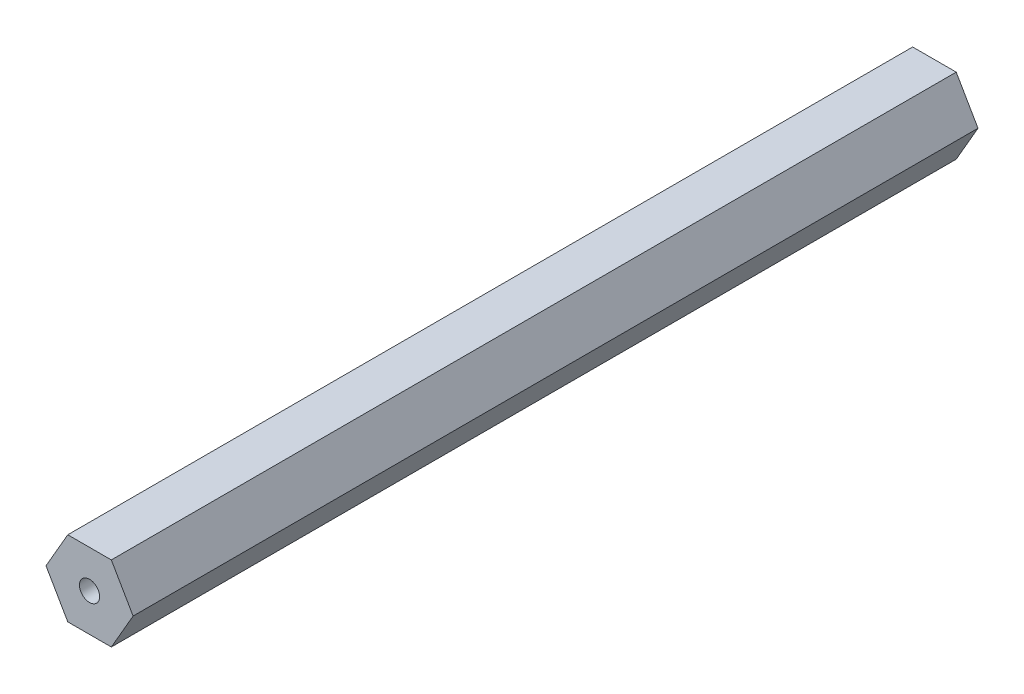
ISO-10303-21;
HEADER;
FILE_DESCRIPTION(('STEP AP214'),'2;1');
FILE_NAME('part.step','',(''),(''),'','','');
FILE_SCHEMA(('AUTOMOTIVE_DESIGN { 1 0 10303 214 1 1 1 1 }'));
ENDSEC;
DATA;
#1=APPLICATION_CONTEXT('core data for automotive mechanical design processes');
#2=APPLICATION_PROTOCOL_DEFINITION('international standard','automotive_design',2000,#1);
#3=PRODUCT_CONTEXT('',#1,'mechanical');
#4=PRODUCT('Part','Part','',(#3));
#5=PRODUCT_RELATED_PRODUCT_CATEGORY('part','',(#4));
#6=PRODUCT_DEFINITION_FORMATION('','',#4);
#7=PRODUCT_DEFINITION_CONTEXT('part definition',#1,'design');
#8=PRODUCT_DEFINITION('design','',#6,#7);
#9=PRODUCT_DEFINITION_SHAPE('','',#8);
#10=(LENGTH_UNIT() NAMED_UNIT(*) SI_UNIT(.MILLI.,.METRE.));
#11=(NAMED_UNIT(*) PLANE_ANGLE_UNIT() SI_UNIT($,.RADIAN.));
#12=(NAMED_UNIT(*) SI_UNIT($,.STERADIAN.) SOLID_ANGLE_UNIT());
#13=UNCERTAINTY_MEASURE_WITH_UNIT(LENGTH_MEASURE(1.E-05),#10,'distance_accuracy_value','');
#14=(GEOMETRIC_REPRESENTATION_CONTEXT(3) GLOBAL_UNCERTAINTY_ASSIGNED_CONTEXT((#13)) GLOBAL_UNIT_ASSIGNED_CONTEXT((#10,
#11,#12)) REPRESENTATION_CONTEXT('',''));
#15=CARTESIAN_POINT('',(0.,0.,0.));
#16=DIRECTION('',(0.,0.,1.));
#17=DIRECTION('',(1.,0.,0.));
#18=AXIS2_PLACEMENT_3D('',#15,#16,#17);
#19=CARTESIAN_POINT('',(0.,0.,106.68));
#20=DIRECTION('',(0.,0.,1.));
#21=DIRECTION('',(1.,0.,0.));
#22=AXIS2_PLACEMENT_3D('',#19,#20,#21);
#23=PLANE('',#22);
#24=DIRECTION('',(0.5,0.866025403784439,0.));
#25=VECTOR('',#24,1.);
#26=CARTESIAN_POINT('',(13.6584086693048,-7.43009006412703,106.68));
#27=LINE('',#26,#25);
#28=CARTESIAN_POINT('',(13.6584086693048,-7.43009006412703,106.68));
#29=VERTEX_POINT('',#28);
#30=CARTESIAN_POINT('',(16.4080393263204,-2.66759006412703,106.68));
#31=VERTEX_POINT('',#30);
#32=EDGE_CURVE('E133',#29,#31,#27,.T.);
#33=ORIENTED_EDGE('',*,*,#32,.T.);
#34=DIRECTION('',(-0.5,0.866025403784439,0.));
#35=VECTOR('',#34,1.);
#36=CARTESIAN_POINT('',(16.4080393263204,-2.66759006412703,106.68));
#37=LINE('',#36,#35);
#38=CARTESIAN_POINT('',(13.6584086693048,2.09490993587297,106.68));
#39=VERTEX_POINT('',#38);
#40=EDGE_CURVE('E91',#31,#39,#37,.T.);
#41=ORIENTED_EDGE('',*,*,#40,.T.);
#42=DIRECTION('',(-1.,0.,0.));
#43=VECTOR('',#42,1.);
#44=CARTESIAN_POINT('',(13.6584086693048,2.09490993587297,106.68));
#45=LINE('',#44,#43);
#46=CARTESIAN_POINT('',(8.1591473552736,2.09490993587297,106.68));
#47=VERTEX_POINT('',#46);
#48=EDGE_CURVE('E104',#39,#47,#45,.T.);
#49=ORIENTED_EDGE('',*,*,#48,.T.);
#50=DIRECTION('',(-0.5,-0.866025403784439,0.));
#51=VECTOR('',#50,1.);
#52=CARTESIAN_POINT('',(8.1591473552736,2.09490993587297,106.68));
#53=LINE('',#52,#51);
#54=CARTESIAN_POINT('',(5.40951669825801,-2.66759006412703,106.68));
#55=VERTEX_POINT('',#54);
#56=EDGE_CURVE('E98',#47,#55,#53,.T.);
#57=ORIENTED_EDGE('',*,*,#56,.T.);
#58=DIRECTION('',(0.5,-0.866025403784438,0.));
#59=VECTOR('',#58,1.);
#60=CARTESIAN_POINT('',(5.40951669825801,-2.66759006412703,106.68));
#61=LINE('',#60,#59);
#62=CARTESIAN_POINT('',(8.1591473552736,-7.43009006412703,106.68));
#63=VERTEX_POINT('',#62);
#64=EDGE_CURVE('E102',#55,#63,#61,.T.);
#65=ORIENTED_EDGE('',*,*,#64,.T.);
#66=DIRECTION('',(1.,0.,0.));
#67=VECTOR('',#66,1.);
#68=CARTESIAN_POINT('',(8.1591473552736,-7.43009006412703,106.68));
#69=LINE('',#68,#67);
#70=EDGE_CURVE('E54',#63,#29,#69,.T.);
#71=ORIENTED_EDGE('',*,*,#70,.T.);
#72=EDGE_LOOP('',(#33,#41,#49,#57,#65,#71));
#73=FACE_BOUND('',#72,.T.);
#74=CARTESIAN_POINT('',(10.9087780122892,-2.66759006412703,106.68));
#75=DIRECTION('',(0.,0.,1.));
#76=DIRECTION('',(1.,0.,0.));
#77=AXIS2_PLACEMENT_3D('',#74,#75,#76);
#78=CIRCLE('',#77,1.27);
#79=CARTESIAN_POINT('',(12.1787780122892,-2.66759006412703,106.68));
#80=VERTEX_POINT('',#79);
#81=EDGE_CURVE('E126',#80,#80,#78,.T.);
#82=ORIENTED_EDGE('',*,*,#81,.F.);
#83=EDGE_LOOP('',(#82));
#84=FACE_BOUND('',#83,.T.);
#85=ADVANCED_FACE('F37',(#73,#84),#23,.T.);
#86=CARTESIAN_POINT('',(0.,0.,0.));
#87=DIRECTION('',(0.,0.,1.));
#88=DIRECTION('',(1.,0.,0.));
#89=AXIS2_PLACEMENT_3D('',#86,#87,#88);
#90=PLANE('',#89);
#91=DIRECTION('',(0.5,0.866025403784439,0.));
#92=VECTOR('',#91,1.);
#93=CARTESIAN_POINT('',(13.6584086693048,-7.43009006412703,0.));
#94=LINE('',#93,#92);
#95=CARTESIAN_POINT('',(13.6584086693048,-7.43009006412703,0.));
#96=VERTEX_POINT('',#95);
#97=CARTESIAN_POINT('',(16.4080393263204,-2.66759006412703,0.));
#98=VERTEX_POINT('',#97);
#99=EDGE_CURVE('E122',#96,#98,#94,.T.);
#100=ORIENTED_EDGE('',*,*,#99,.F.);
#101=DIRECTION('',(1.,0.,0.));
#102=VECTOR('',#101,1.);
#103=CARTESIAN_POINT('',(8.1591473552736,-7.43009006412703,0.));
#104=LINE('',#103,#102);
#105=CARTESIAN_POINT('',(8.1591473552736,-7.43009006412703,0.));
#106=VERTEX_POINT('',#105);
#107=EDGE_CURVE('E83',#106,#96,#104,.T.);
#108=ORIENTED_EDGE('',*,*,#107,.F.);
#109=DIRECTION('',(0.5,-0.866025403784438,0.));
#110=VECTOR('',#109,1.);
#111=CARTESIAN_POINT('',(5.40951669825801,-2.66759006412703,0.));
#112=LINE('',#111,#110);
#113=CARTESIAN_POINT('',(5.40951669825801,-2.66759006412703,0.));
#114=VERTEX_POINT('',#113);
#115=EDGE_CURVE('E77',#114,#106,#112,.T.);
#116=ORIENTED_EDGE('',*,*,#115,.F.);
#117=DIRECTION('',(-0.5,-0.866025403784439,0.));
#118=VECTOR('',#117,1.);
#119=CARTESIAN_POINT('',(8.1591473552736,2.09490993587297,0.));
#120=LINE('',#119,#118);
#121=CARTESIAN_POINT('',(8.1591473552736,2.09490993587297,0.));
#122=VERTEX_POINT('',#121);
#123=EDGE_CURVE('E112',#122,#114,#120,.T.);
#124=ORIENTED_EDGE('',*,*,#123,.F.);
#125=DIRECTION('',(-1.,0.,0.));
#126=VECTOR('',#125,1.);
#127=CARTESIAN_POINT('',(13.6584086693048,2.09490993587297,0.));
#128=LINE('',#127,#126);
#129=CARTESIAN_POINT('',(13.6584086693048,2.09490993587297,0.));
#130=VERTEX_POINT('',#129);
#131=EDGE_CURVE('E128',#130,#122,#128,.T.);
#132=ORIENTED_EDGE('',*,*,#131,.F.);
#133=DIRECTION('',(-0.5,0.866025403784439,0.));
#134=VECTOR('',#133,1.);
#135=CARTESIAN_POINT('',(16.4080393263204,-2.66759006412703,0.));
#136=LINE('',#135,#134);
#137=EDGE_CURVE('E125',#98,#130,#136,.T.);
#138=ORIENTED_EDGE('',*,*,#137,.F.);
#139=EDGE_LOOP('',(#100,#108,#116,#124,#132,#138));
#140=FACE_BOUND('',#139,.T.);
#141=CARTESIAN_POINT('',(10.9087780122892,-2.66759006412703,0.));
#142=DIRECTION('',(0.,0.,1.));
#143=DIRECTION('',(1.,0.,0.));
#144=AXIS2_PLACEMENT_3D('',#141,#142,#143);
#145=CIRCLE('',#144,1.27);
#146=CARTESIAN_POINT('',(12.1787780122892,-2.66759006412703,0.));
#147=VERTEX_POINT('',#146);
#148=EDGE_CURVE('E244',#147,#147,#145,.T.);
#149=ORIENTED_EDGE('',*,*,#148,.T.);
#150=EDGE_LOOP('',(#149));
#151=FACE_BOUND('',#150,.T.);
#152=ADVANCED_FACE('F142',(#140,#151),#90,.F.);
#153=CARTESIAN_POINT('',(13.6584086693048,-7.43009006412703,106.68));
#154=DIRECTION('',(-0.866025403784439,0.5,0.));
#155=DIRECTION('',(-0.5,-0.866025403784439,0.));
#156=AXIS2_PLACEMENT_3D('',#153,#154,#155);
#157=PLANE('',#156);
#158=ORIENTED_EDGE('',*,*,#99,.T.);
#159=DIRECTION('',(0.,0.,-1.));
#160=VECTOR('',#159,1.);
#161=CARTESIAN_POINT('',(16.4080393263204,-2.66759006412703,106.68));
#162=LINE('',#161,#160);
#163=EDGE_CURVE('E11',#31,#98,#162,.T.);
#164=ORIENTED_EDGE('',*,*,#163,.F.);
#165=ORIENTED_EDGE('',*,*,#32,.F.);
#166=DIRECTION('',(0.,0.,-1.));
#167=VECTOR('',#166,1.);
#168=CARTESIAN_POINT('',(13.6584086693048,-7.43009006412703,106.68));
#169=LINE('',#168,#167);
#170=EDGE_CURVE('E118',#29,#96,#169,.T.);
#171=ORIENTED_EDGE('',*,*,#170,.T.);
#172=EDGE_LOOP('',(#158,#164,#165,#171));
#173=FACE_BOUND('',#172,.T.);
#174=ADVANCED_FACE('F39',(#173),#157,.F.);
#175=CARTESIAN_POINT('',(16.4080393263204,-2.66759006412703,106.68));
#176=DIRECTION('',(-0.866025403784439,-0.5,0.));
#177=DIRECTION('',(0.5,-0.866025403784439,0.));
#178=AXIS2_PLACEMENT_3D('',#175,#176,#177);
#179=PLANE('',#178);
#180=ORIENTED_EDGE('',*,*,#137,.T.);
#181=DIRECTION('',(0.,0.,-1.));
#182=VECTOR('',#181,1.);
#183=CARTESIAN_POINT('',(13.6584086693048,2.09490993587297,106.68));
#184=LINE('',#183,#182);
#185=EDGE_CURVE('E46',#39,#130,#184,.T.);
#186=ORIENTED_EDGE('',*,*,#185,.F.);
#187=ORIENTED_EDGE('',*,*,#40,.F.);
#188=ORIENTED_EDGE('',*,*,#163,.T.);
#189=EDGE_LOOP('',(#180,#186,#187,#188));
#190=FACE_BOUND('',#189,.T.);
#191=ADVANCED_FACE('F167',(#190),#179,.F.);
#192=CARTESIAN_POINT('',(13.6584086693048,2.09490993587297,106.68));
#193=DIRECTION('',(0.,-1.,0.));
#194=DIRECTION('',(0.,0.,-1.));
#195=AXIS2_PLACEMENT_3D('',#192,#193,#194);
#196=PLANE('',#195);
#197=ORIENTED_EDGE('',*,*,#131,.T.);
#198=DIRECTION('',(0.,0.,-1.));
#199=VECTOR('',#198,1.);
#200=CARTESIAN_POINT('',(8.1591473552736,2.09490993587297,106.68));
#201=LINE('',#200,#199);
#202=EDGE_CURVE('E113',#47,#122,#201,.T.);
#203=ORIENTED_EDGE('',*,*,#202,.F.);
#204=ORIENTED_EDGE('',*,*,#48,.F.);
#205=ORIENTED_EDGE('',*,*,#185,.T.);
#206=EDGE_LOOP('',(#197,#203,#204,#205));
#207=FACE_BOUND('',#206,.T.);
#208=ADVANCED_FACE('F139',(#207),#196,.F.);
#209=CARTESIAN_POINT('',(8.1591473552736,2.09490993587297,106.68));
#210=DIRECTION('',(0.866025403784439,-0.5,0.));
#211=DIRECTION('',(0.5,0.866025403784439,0.));
#212=AXIS2_PLACEMENT_3D('',#209,#210,#211);
#213=PLANE('',#212);
#214=ORIENTED_EDGE('',*,*,#123,.T.);
#215=DIRECTION('',(0.,0.,-1.));
#216=VECTOR('',#215,1.);
#217=CARTESIAN_POINT('',(5.40951669825801,-2.66759006412703,106.68));
#218=LINE('',#217,#216);
#219=EDGE_CURVE('E109',#55,#114,#218,.T.);
#220=ORIENTED_EDGE('',*,*,#219,.F.);
#221=ORIENTED_EDGE('',*,*,#56,.F.);
#222=ORIENTED_EDGE('',*,*,#202,.T.);
#223=EDGE_LOOP('',(#214,#220,#221,#222));
#224=FACE_BOUND('',#223,.T.);
#225=ADVANCED_FACE('F110',(#224),#213,.F.);
#226=CARTESIAN_POINT('',(5.40951669825801,-2.66759006412703,106.68));
#227=DIRECTION('',(0.866025403784438,0.5,0.));
#228=DIRECTION('',(-0.5,0.866025403784438,0.));
#229=AXIS2_PLACEMENT_3D('',#226,#227,#228);
#230=PLANE('',#229);
#231=ORIENTED_EDGE('',*,*,#115,.T.);
#232=DIRECTION('',(0.,0.,-1.));
#233=VECTOR('',#232,1.);
#234=CARTESIAN_POINT('',(8.1591473552736,-7.43009006412703,106.68));
#235=LINE('',#234,#233);
#236=EDGE_CURVE('E114',#63,#106,#235,.T.);
#237=ORIENTED_EDGE('',*,*,#236,.F.);
#238=ORIENTED_EDGE('',*,*,#64,.F.);
#239=ORIENTED_EDGE('',*,*,#219,.T.);
#240=EDGE_LOOP('',(#231,#237,#238,#239));
#241=FACE_BOUND('',#240,.T.);
#242=ADVANCED_FACE('F116',(#241),#230,.F.);
#243=CARTESIAN_POINT('',(8.1591473552736,-7.43009006412703,106.68));
#244=DIRECTION('',(0.,1.,0.));
#245=DIRECTION('',(-1.,0.,0.));
#246=AXIS2_PLACEMENT_3D('',#243,#244,#245);
#247=PLANE('',#246);
#248=ORIENTED_EDGE('',*,*,#107,.T.);
#249=ORIENTED_EDGE('',*,*,#170,.F.);
#250=ORIENTED_EDGE('',*,*,#70,.F.);
#251=ORIENTED_EDGE('',*,*,#236,.T.);
#252=EDGE_LOOP('',(#248,#249,#250,#251));
#253=FACE_BOUND('',#252,.T.);
#254=ADVANCED_FACE('F147',(#253),#247,.F.);
#255=CARTESIAN_POINT('',(10.9087780122892,-2.66759006412703,106.68));
#256=DIRECTION('',(0.,0.,-1.));
#257=DIRECTION('',(-1.,0.,0.));
#258=AXIS2_PLACEMENT_3D('',#255,#256,#257);
#259=CYLINDRICAL_SURFACE('',#258,1.27);
#260=ORIENTED_EDGE('',*,*,#81,.T.);
#261=EDGE_LOOP('',(#260));
#262=FACE_BOUND('',#261,.T.);
#263=ORIENTED_EDGE('',*,*,#148,.F.);
#264=EDGE_LOOP('',(#263));
#265=FACE_BOUND('',#264,.T.);
#266=ADVANCED_FACE('F149',(#262,#265),#259,.F.);
#267=CLOSED_SHELL('',(#85,#152,#174,#191,#208,#225,#242,#254,#266));
#268=MANIFOLD_SOLID_BREP('B2',#267);
#269=ADVANCED_BREP_SHAPE_REPRESENTATION('',(#18,#268),#14);
#270=SHAPE_DEFINITION_REPRESENTATION(#9,#269);
ENDSEC;
END-ISO-10303-21;
